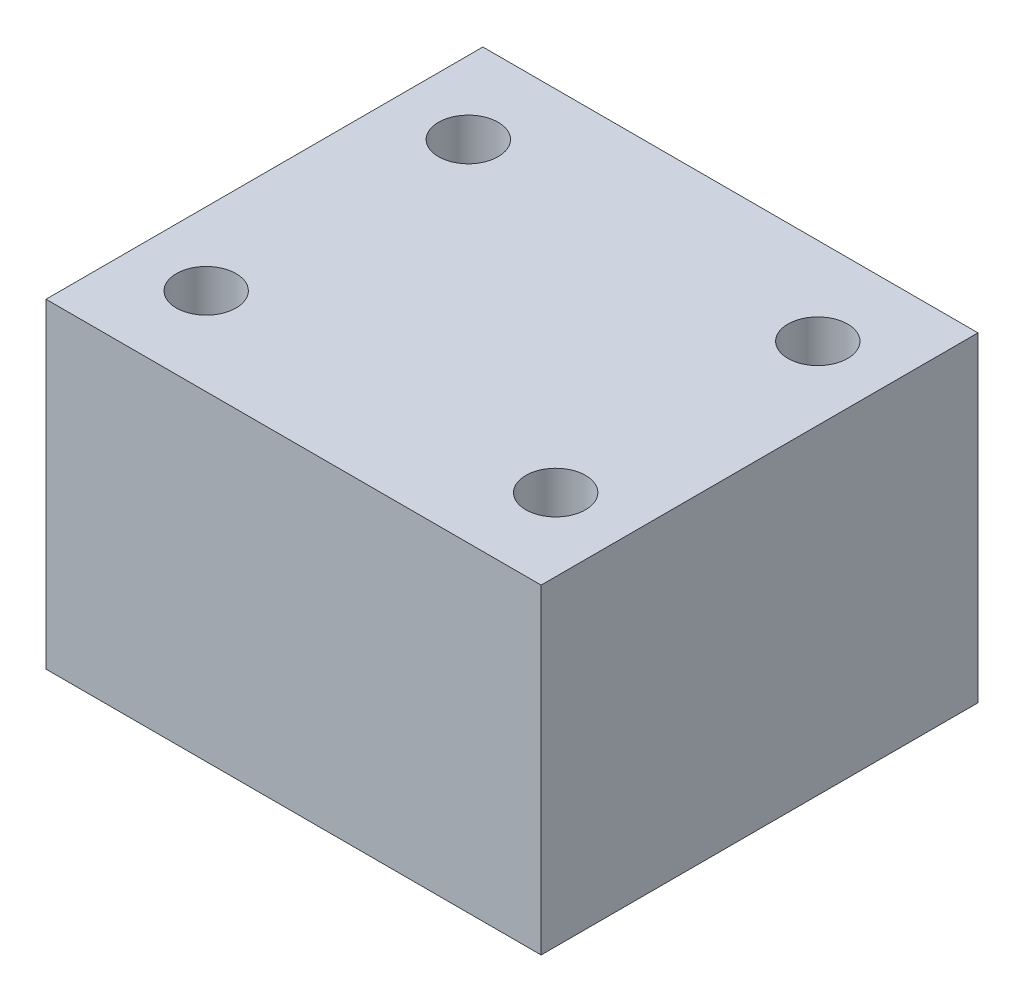
ISO-10303-21;
HEADER;
FILE_DESCRIPTION(('STEP AP214'),'2;1');
FILE_NAME('part.step','',(''),(''),'','','');
FILE_SCHEMA(('AUTOMOTIVE_DESIGN { 1 0 10303 214 1 1 1 1 }'));
ENDSEC;
DATA;
#1=APPLICATION_CONTEXT('core data for automotive mechanical design processes');
#2=APPLICATION_PROTOCOL_DEFINITION('international standard','automotive_design',2000,#1);
#3=PRODUCT_CONTEXT('',#1,'mechanical');
#4=PRODUCT('Part','Part','',(#3));
#5=PRODUCT_RELATED_PRODUCT_CATEGORY('part','',(#4));
#6=PRODUCT_DEFINITION_FORMATION('','',#4);
#7=PRODUCT_DEFINITION_CONTEXT('part definition',#1,'design');
#8=PRODUCT_DEFINITION('design','',#6,#7);
#9=PRODUCT_DEFINITION_SHAPE('','',#8);
#10=(LENGTH_UNIT() NAMED_UNIT(*) SI_UNIT(.MILLI.,.METRE.));
#11=(NAMED_UNIT(*) PLANE_ANGLE_UNIT() SI_UNIT($,.RADIAN.));
#12=(NAMED_UNIT(*) SI_UNIT($,.STERADIAN.) SOLID_ANGLE_UNIT());
#13=UNCERTAINTY_MEASURE_WITH_UNIT(LENGTH_MEASURE(1.E-05),#10,'distance_accuracy_value','');
#14=(GEOMETRIC_REPRESENTATION_CONTEXT(3) GLOBAL_UNCERTAINTY_ASSIGNED_CONTEXT((#13)) GLOBAL_UNIT_ASSIGNED_CONTEXT((#10,
#11,#12)) REPRESENTATION_CONTEXT('',''));
#15=CARTESIAN_POINT('',(0.,0.,0.));
#16=DIRECTION('',(0.,0.,1.));
#17=DIRECTION('',(1.,0.,0.));
#18=AXIS2_PLACEMENT_3D('',#15,#16,#17);
#19=CARTESIAN_POINT('',(0.,22.,-30.));
#20=DIRECTION('',(-1.,0.,0.));
#21=DIRECTION('',(0.,0.,1.));
#22=AXIS2_PLACEMENT_3D('',#19,#20,#21);
#23=PLANE('',#22);
#24=DIRECTION('',(0.,-1.,0.));
#25=VECTOR('',#24,1.);
#26=CARTESIAN_POINT('',(0.,22.,0.));
#27=LINE('',#26,#25);
#28=CARTESIAN_POINT('',(0.,22.,0.));
#29=VERTEX_POINT('',#28);
#30=CARTESIAN_POINT('',(0.,0.,0.));
#31=VERTEX_POINT('',#30);
#32=EDGE_CURVE('E100',#29,#31,#27,.T.);
#33=ORIENTED_EDGE('',*,*,#32,.F.);
#34=DIRECTION('',(0.,0.,1.));
#35=VECTOR('',#34,1.);
#36=CARTESIAN_POINT('',(0.,22.,-30.));
#37=LINE('',#36,#35);
#38=CARTESIAN_POINT('',(0.,22.,-30.));
#39=VERTEX_POINT('',#38);
#40=EDGE_CURVE('E11',#39,#29,#37,.T.);
#41=ORIENTED_EDGE('',*,*,#40,.F.);
#42=DIRECTION('',(0.,-1.,0.));
#43=VECTOR('',#42,1.);
#44=CARTESIAN_POINT('',(0.,22.,-30.));
#45=LINE('',#44,#43);
#46=CARTESIAN_POINT('',(0.,0.,-30.));
#47=VERTEX_POINT('',#46);
#48=EDGE_CURVE('E93',#39,#47,#45,.T.);
#49=ORIENTED_EDGE('',*,*,#48,.T.);
#50=DIRECTION('',(0.,0.,1.));
#51=VECTOR('',#50,1.);
#52=CARTESIAN_POINT('',(0.,0.,-30.));
#53=LINE('',#52,#51);
#54=EDGE_CURVE('E76',#47,#31,#53,.T.);
#55=ORIENTED_EDGE('',*,*,#54,.T.);
#56=EDGE_LOOP('',(#33,#41,#49,#55));
#57=FACE_BOUND('',#56,.T.);
#58=ADVANCED_FACE('F33',(#57),#23,.T.);
#59=CARTESIAN_POINT('',(34.,22.,-30.));
#60=DIRECTION('',(0.,1.,0.));
#61=DIRECTION('',(0.,0.,1.));
#62=AXIS2_PLACEMENT_3D('',#59,#60,#61);
#63=PLANE('',#62);
#64=CARTESIAN_POINT('',(5.,22.,-6.));
#65=DIRECTION('',(0.,1.,0.));
#66=DIRECTION('',(0.,0.,1.));
#67=AXIS2_PLACEMENT_3D('',#64,#65,#66);
#68=CIRCLE('',#67,2.05);
#69=CARTESIAN_POINT('',(5.,22.,-3.95));
#70=VERTEX_POINT('',#69);
#71=EDGE_CURVE('E117',#70,#70,#68,.T.);
#72=ORIENTED_EDGE('',*,*,#71,.F.);
#73=EDGE_LOOP('',(#72));
#74=FACE_BOUND('',#73,.T.);
#75=CARTESIAN_POINT('',(5.,22.,-24.));
#76=DIRECTION('',(0.,1.,0.));
#77=DIRECTION('',(0.,0.,1.));
#78=AXIS2_PLACEMENT_3D('',#75,#76,#77);
#79=CIRCLE('',#78,2.05);
#80=CARTESIAN_POINT('',(5.,22.,-21.95));
#81=VERTEX_POINT('',#80);
#82=EDGE_CURVE('E131',#81,#81,#79,.T.);
#83=ORIENTED_EDGE('',*,*,#82,.F.);
#84=EDGE_LOOP('',(#83));
#85=FACE_BOUND('',#84,.T.);
#86=CARTESIAN_POINT('',(29.,22.,-24.));
#87=DIRECTION('',(0.,1.,0.));
#88=DIRECTION('',(0.,0.,1.));
#89=AXIS2_PLACEMENT_3D('',#86,#87,#88);
#90=CIRCLE('',#89,2.05);
#91=CARTESIAN_POINT('',(29.,22.,-21.95));
#92=VERTEX_POINT('',#91);
#93=EDGE_CURVE('E128',#92,#92,#90,.T.);
#94=ORIENTED_EDGE('',*,*,#93,.F.);
#95=EDGE_LOOP('',(#94));
#96=FACE_BOUND('',#95,.T.);
#97=CARTESIAN_POINT('',(29.,22.,-6.));
#98=DIRECTION('',(0.,1.,0.));
#99=DIRECTION('',(0.,0.,1.));
#100=AXIS2_PLACEMENT_3D('',#97,#98,#99);
#101=CIRCLE('',#100,2.05);
#102=CARTESIAN_POINT('',(29.,22.,-3.95));
#103=VERTEX_POINT('',#102);
#104=EDGE_CURVE('E113',#103,#103,#101,.T.);
#105=ORIENTED_EDGE('',*,*,#104,.F.);
#106=EDGE_LOOP('',(#105));
#107=FACE_BOUND('',#106,.T.);
#108=DIRECTION('',(-1.,0.,0.));
#109=VECTOR('',#108,1.);
#110=CARTESIAN_POINT('',(34.,22.,0.));
#111=LINE('',#110,#109);
#112=CARTESIAN_POINT('',(34.,22.,0.));
#113=VERTEX_POINT('',#112);
#114=EDGE_CURVE('E95',#113,#29,#111,.T.);
#115=ORIENTED_EDGE('',*,*,#114,.F.);
#116=DIRECTION('',(0.,0.,1.));
#117=VECTOR('',#116,1.);
#118=CARTESIAN_POINT('',(34.,22.,-30.));
#119=LINE('',#118,#117);
#120=CARTESIAN_POINT('',(34.,22.,-30.));
#121=VERTEX_POINT('',#120);
#122=EDGE_CURVE('E42',#121,#113,#119,.T.);
#123=ORIENTED_EDGE('',*,*,#122,.F.);
#124=DIRECTION('',(-1.,0.,0.));
#125=VECTOR('',#124,1.);
#126=CARTESIAN_POINT('',(34.,22.,-30.));
#127=LINE('',#126,#125);
#128=EDGE_CURVE('E90',#121,#39,#127,.T.);
#129=ORIENTED_EDGE('',*,*,#128,.T.);
#130=ORIENTED_EDGE('',*,*,#40,.T.);
#131=EDGE_LOOP('',(#115,#123,#129,#130));
#132=FACE_BOUND('',#131,.T.);
#133=ADVANCED_FACE('F139',(#74,#85,#96,#107,#132),#63,.T.);
#134=CARTESIAN_POINT('',(34.,0.,-30.));
#135=DIRECTION('',(1.,0.,0.));
#136=DIRECTION('',(0.,0.,-1.));
#137=AXIS2_PLACEMENT_3D('',#134,#135,#136);
#138=PLANE('',#137);
#139=DIRECTION('',(0.,1.,0.));
#140=VECTOR('',#139,1.);
#141=CARTESIAN_POINT('',(34.,0.,0.));
#142=LINE('',#141,#140);
#143=CARTESIAN_POINT('',(34.,0.,0.));
#144=VERTEX_POINT('',#143);
#145=EDGE_CURVE('E84',#144,#113,#142,.T.);
#146=ORIENTED_EDGE('',*,*,#145,.F.);
#147=DIRECTION('',(0.,0.,1.));
#148=VECTOR('',#147,1.);
#149=CARTESIAN_POINT('',(34.,0.,-30.));
#150=LINE('',#149,#148);
#151=CARTESIAN_POINT('',(34.,0.,-30.));
#152=VERTEX_POINT('',#151);
#153=EDGE_CURVE('E79',#152,#144,#150,.T.);
#154=ORIENTED_EDGE('',*,*,#153,.F.);
#155=DIRECTION('',(0.,1.,0.));
#156=VECTOR('',#155,1.);
#157=CARTESIAN_POINT('',(34.,0.,-30.));
#158=LINE('',#157,#156);
#159=EDGE_CURVE('E82',#152,#121,#158,.T.);
#160=ORIENTED_EDGE('',*,*,#159,.T.);
#161=ORIENTED_EDGE('',*,*,#122,.T.);
#162=EDGE_LOOP('',(#146,#154,#160,#161));
#163=FACE_BOUND('',#162,.T.);
#164=ADVANCED_FACE('F81',(#163),#138,.T.);
#165=CARTESIAN_POINT('',(0.,0.,-30.));
#166=DIRECTION('',(0.,-1.,0.));
#167=DIRECTION('',(0.,0.,-1.));
#168=AXIS2_PLACEMENT_3D('',#165,#166,#167);
#169=PLANE('',#168);
#170=CARTESIAN_POINT('',(5.,0.,-6.));
#171=DIRECTION('',(0.,-1.,0.));
#172=DIRECTION('',(0.,0.,-1.));
#173=AXIS2_PLACEMENT_3D('',#170,#171,#172);
#174=CIRCLE('',#173,2.05);
#175=CARTESIAN_POINT('',(5.,0.,-8.05));
#176=VERTEX_POINT('',#175);
#177=EDGE_CURVE('E36',#176,#176,#174,.T.);
#178=ORIENTED_EDGE('',*,*,#177,.F.);
#179=EDGE_LOOP('',(#178));
#180=FACE_BOUND('',#179,.T.);
#181=CARTESIAN_POINT('',(5.,0.,-24.));
#182=DIRECTION('',(0.,-1.,0.));
#183=DIRECTION('',(0.,0.,-1.));
#184=AXIS2_PLACEMENT_3D('',#181,#182,#183);
#185=CIRCLE('',#184,2.05);
#186=CARTESIAN_POINT('',(5.,0.,-26.05));
#187=VERTEX_POINT('',#186);
#188=EDGE_CURVE('E116',#187,#187,#185,.T.);
#189=ORIENTED_EDGE('',*,*,#188,.F.);
#190=EDGE_LOOP('',(#189));
#191=FACE_BOUND('',#190,.T.);
#192=CARTESIAN_POINT('',(29.,0.,-24.));
#193=DIRECTION('',(0.,-1.,0.));
#194=DIRECTION('',(0.,0.,-1.));
#195=AXIS2_PLACEMENT_3D('',#192,#193,#194);
#196=CIRCLE('',#195,2.05);
#197=CARTESIAN_POINT('',(29.,0.,-26.05));
#198=VERTEX_POINT('',#197);
#199=EDGE_CURVE('E114',#198,#198,#196,.T.);
#200=ORIENTED_EDGE('',*,*,#199,.F.);
#201=EDGE_LOOP('',(#200));
#202=FACE_BOUND('',#201,.T.);
#203=CARTESIAN_POINT('',(29.,0.,-6.));
#204=DIRECTION('',(0.,-1.,0.));
#205=DIRECTION('',(0.,0.,-1.));
#206=AXIS2_PLACEMENT_3D('',#203,#204,#205);
#207=CIRCLE('',#206,2.05);
#208=CARTESIAN_POINT('',(29.,0.,-8.05));
#209=VERTEX_POINT('',#208);
#210=EDGE_CURVE('E104',#209,#209,#207,.T.);
#211=ORIENTED_EDGE('',*,*,#210,.F.);
#212=EDGE_LOOP('',(#211));
#213=FACE_BOUND('',#212,.T.);
#214=DIRECTION('',(1.,0.,0.));
#215=VECTOR('',#214,1.);
#216=CARTESIAN_POINT('',(0.,0.,0.));
#217=LINE('',#216,#215);
#218=EDGE_CURVE('E103',#31,#144,#217,.T.);
#219=ORIENTED_EDGE('',*,*,#218,.F.);
#220=ORIENTED_EDGE('',*,*,#54,.F.);
#221=DIRECTION('',(1.,0.,0.));
#222=VECTOR('',#221,1.);
#223=CARTESIAN_POINT('',(0.,0.,-30.));
#224=LINE('',#223,#222);
#225=EDGE_CURVE('E89',#47,#152,#224,.T.);
#226=ORIENTED_EDGE('',*,*,#225,.T.);
#227=ORIENTED_EDGE('',*,*,#153,.T.);
#228=EDGE_LOOP('',(#219,#220,#226,#227));
#229=FACE_BOUND('',#228,.T.);
#230=ADVANCED_FACE('F92',(#180,#191,#202,#213,#229),#169,.T.);
#231=CARTESIAN_POINT('',(0.,0.,-30.));
#232=DIRECTION('',(0.,0.,1.));
#233=DIRECTION('',(1.,0.,0.));
#234=AXIS2_PLACEMENT_3D('',#231,#232,#233);
#235=PLANE('',#234);
#236=ORIENTED_EDGE('',*,*,#48,.F.);
#237=ORIENTED_EDGE('',*,*,#128,.F.);
#238=ORIENTED_EDGE('',*,*,#159,.F.);
#239=ORIENTED_EDGE('',*,*,#225,.F.);
#240=EDGE_LOOP('',(#236,#237,#238,#239));
#241=FACE_BOUND('',#240,.T.);
#242=ADVANCED_FACE('F88',(#241),#235,.F.);
#243=CARTESIAN_POINT('',(0.,0.,0.));
#244=DIRECTION('',(0.,0.,1.));
#245=DIRECTION('',(1.,0.,0.));
#246=AXIS2_PLACEMENT_3D('',#243,#244,#245);
#247=PLANE('',#246);
#248=ORIENTED_EDGE('',*,*,#32,.T.);
#249=ORIENTED_EDGE('',*,*,#218,.T.);
#250=ORIENTED_EDGE('',*,*,#145,.T.);
#251=ORIENTED_EDGE('',*,*,#114,.T.);
#252=EDGE_LOOP('',(#248,#249,#250,#251));
#253=FACE_BOUND('',#252,.T.);
#254=ADVANCED_FACE('F148',(#253),#247,.T.);
#255=CARTESIAN_POINT('',(29.,-8.,-6.));
#256=DIRECTION('',(0.,1.,0.));
#257=DIRECTION('',(0.,0.,1.));
#258=AXIS2_PLACEMENT_3D('',#255,#256,#257);
#259=CYLINDRICAL_SURFACE('',#258,2.05);
#260=ORIENTED_EDGE('',*,*,#210,.T.);
#261=EDGE_LOOP('',(#260));
#262=FACE_BOUND('',#261,.T.);
#263=ORIENTED_EDGE('',*,*,#104,.T.);
#264=EDGE_LOOP('',(#263));
#265=FACE_BOUND('',#264,.T.);
#266=ADVANCED_FACE('F181',(#262,#265),#259,.F.);
#267=CARTESIAN_POINT('',(29.,-8.,-24.));
#268=DIRECTION('',(0.,1.,0.));
#269=DIRECTION('',(0.,0.,1.));
#270=AXIS2_PLACEMENT_3D('',#267,#268,#269);
#271=CYLINDRICAL_SURFACE('',#270,2.05);
#272=ORIENTED_EDGE('',*,*,#199,.T.);
#273=EDGE_LOOP('',(#272));
#274=FACE_BOUND('',#273,.T.);
#275=ORIENTED_EDGE('',*,*,#93,.T.);
#276=EDGE_LOOP('',(#275));
#277=FACE_BOUND('',#276,.T.);
#278=ADVANCED_FACE('F187',(#274,#277),#271,.F.);
#279=CARTESIAN_POINT('',(5.,-8.,-24.));
#280=DIRECTION('',(0.,1.,0.));
#281=DIRECTION('',(0.,0.,1.));
#282=AXIS2_PLACEMENT_3D('',#279,#280,#281);
#283=CYLINDRICAL_SURFACE('',#282,2.05);
#284=ORIENTED_EDGE('',*,*,#188,.T.);
#285=EDGE_LOOP('',(#284));
#286=FACE_BOUND('',#285,.T.);
#287=ORIENTED_EDGE('',*,*,#82,.T.);
#288=EDGE_LOOP('',(#287));
#289=FACE_BOUND('',#288,.T.);
#290=ADVANCED_FACE('F195',(#286,#289),#283,.F.);
#291=CARTESIAN_POINT('',(5.,-8.,-6.));
#292=DIRECTION('',(0.,1.,0.));
#293=DIRECTION('',(0.,0.,1.));
#294=AXIS2_PLACEMENT_3D('',#291,#292,#293);
#295=CYLINDRICAL_SURFACE('',#294,2.05);
#296=ORIENTED_EDGE('',*,*,#177,.T.);
#297=EDGE_LOOP('',(#296));
#298=FACE_BOUND('',#297,.T.);
#299=ORIENTED_EDGE('',*,*,#71,.T.);
#300=EDGE_LOOP('',(#299));
#301=FACE_BOUND('',#300,.T.);
#302=ADVANCED_FACE('F137',(#298,#301),#295,.F.);
#303=CLOSED_SHELL('',(#58,#133,#164,#230,#242,#254,#266,#278,#290,#302));
#304=MANIFOLD_SOLID_BREP('B2',#303);
#305=ADVANCED_BREP_SHAPE_REPRESENTATION('',(#18,#304),#14);
#306=SHAPE_DEFINITION_REPRESENTATION(#9,#305);
ENDSEC;
END-ISO-10303-21;
